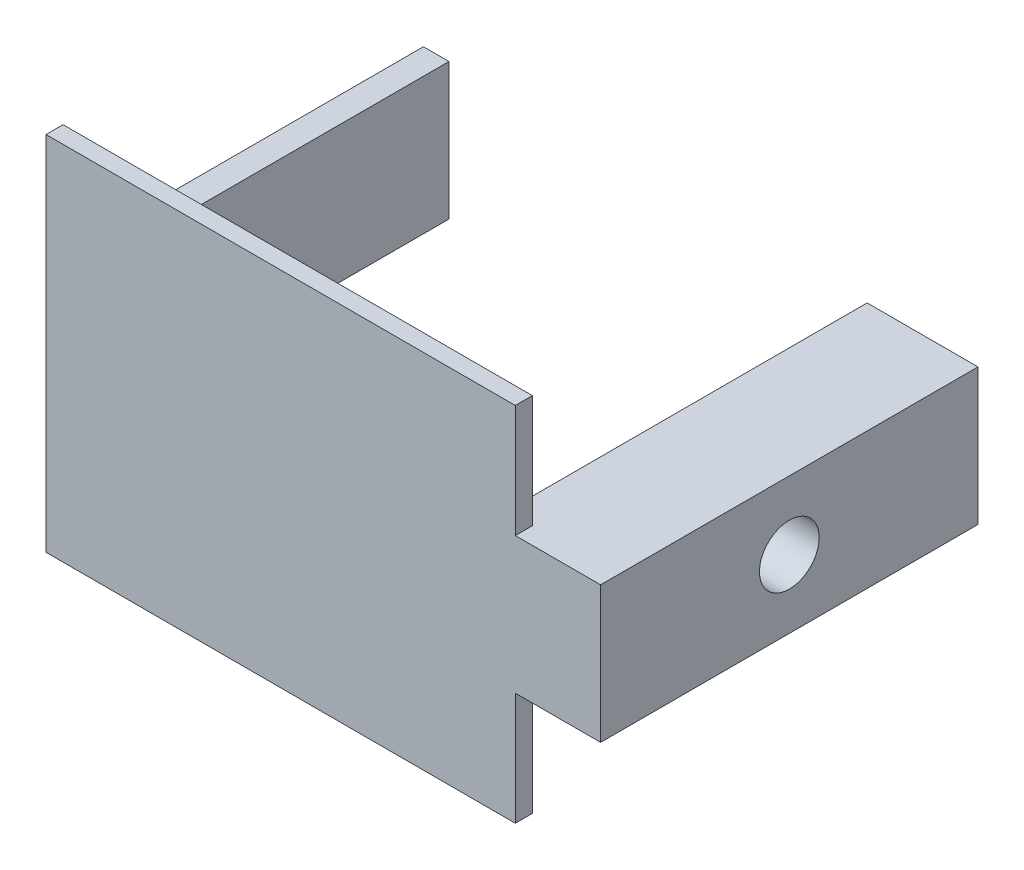
ISO-10303-21;
HEADER;
FILE_DESCRIPTION(('STEP AP214'),'2;1');
FILE_NAME('part.step','',(''),(''),'','','');
FILE_SCHEMA(('AUTOMOTIVE_DESIGN { 1 0 10303 214 1 1 1 1 }'));
ENDSEC;
DATA;
#1=APPLICATION_CONTEXT('core data for automotive mechanical design processes');
#2=APPLICATION_PROTOCOL_DEFINITION('international standard','automotive_design',2000,#1);
#3=PRODUCT_CONTEXT('',#1,'mechanical');
#4=PRODUCT('Part','Part','',(#3));
#5=PRODUCT_RELATED_PRODUCT_CATEGORY('part','',(#4));
#6=PRODUCT_DEFINITION_FORMATION('','',#4);
#7=PRODUCT_DEFINITION_CONTEXT('part definition',#1,'design');
#8=PRODUCT_DEFINITION('design','',#6,#7);
#9=PRODUCT_DEFINITION_SHAPE('','',#8);
#10=(LENGTH_UNIT() NAMED_UNIT(*) SI_UNIT(.MILLI.,.METRE.));
#11=(NAMED_UNIT(*) PLANE_ANGLE_UNIT() SI_UNIT($,.RADIAN.));
#12=(NAMED_UNIT(*) SI_UNIT($,.STERADIAN.) SOLID_ANGLE_UNIT());
#13=UNCERTAINTY_MEASURE_WITH_UNIT(LENGTH_MEASURE(1.E-05),#10,'distance_accuracy_value','');
#14=(GEOMETRIC_REPRESENTATION_CONTEXT(3) GLOBAL_UNCERTAINTY_ASSIGNED_CONTEXT((#13)) GLOBAL_UNIT_ASSIGNED_CONTEXT((#10,
#11,#12)) REPRESENTATION_CONTEXT('',''));
#15=CARTESIAN_POINT('',(0.,0.,0.));
#16=DIRECTION('',(0.,0.,1.));
#17=DIRECTION('',(1.,0.,0.));
#18=AXIS2_PLACEMENT_3D('',#15,#16,#17);
#19=CARTESIAN_POINT('',(27.512132034356,8.,58.7788205960997));
#20=DIRECTION('',(-1.,0.,0.));
#21=DIRECTION('',(0.,0.,1.));
#22=AXIS2_PLACEMENT_3D('',#19,#20,#21);
#23=PLANE('',#22);
#24=DIRECTION('',(0.,0.,-1.));
#25=VECTOR('',#24,1.);
#26=CARTESIAN_POINT('',(27.512132034356,-8.,0.));
#27=LINE('',#26,#25);
#28=CARTESIAN_POINT('',(27.512132034356,-8.,44.25));
#29=VERTEX_POINT('',#28);
#30=CARTESIAN_POINT('',(27.512132034356,-8.,42.25));
#31=VERTEX_POINT('',#30);
#32=EDGE_CURVE('E50',#29,#31,#27,.T.);
#33=ORIENTED_EDGE('',*,*,#32,.F.);
#34=DIRECTION('',(0.,1.,0.));
#35=VECTOR('',#34,1.);
#36=CARTESIAN_POINT('',(27.512132034356,21.212132034356,44.25));
#37=LINE('',#36,#35);
#38=CARTESIAN_POINT('',(27.512132034356,-21.212132034356,44.25));
#39=VERTEX_POINT('',#38);
#40=EDGE_CURVE('E214',#39,#29,#37,.T.);
#41=ORIENTED_EDGE('',*,*,#40,.F.);
#42=DIRECTION('',(0.,0.,-1.));
#43=VECTOR('',#42,1.);
#44=CARTESIAN_POINT('',(27.512132034356,-21.212132034356,44.25));
#45=LINE('',#44,#43);
#46=CARTESIAN_POINT('',(27.512132034356,-21.212132034356,42.25));
#47=VERTEX_POINT('',#46);
#48=EDGE_CURVE('E233',#39,#47,#45,.T.);
#49=ORIENTED_EDGE('',*,*,#48,.T.);
#50=DIRECTION('',(0.,1.,0.));
#51=VECTOR('',#50,1.);
#52=CARTESIAN_POINT('',(27.512132034356,21.212132034356,42.25));
#53=LINE('',#52,#51);
#54=EDGE_CURVE('E225',#47,#31,#53,.T.);
#55=ORIENTED_EDGE('',*,*,#54,.T.);
#56=EDGE_LOOP('',(#33,#41,#49,#55));
#57=FACE_BOUND('',#56,.T.);
#58=ADVANCED_FACE('F33',(#57),#23,.F.);
#59=CARTESIAN_POINT('',(0.,0.,42.25));
#60=DIRECTION('',(0.,0.,1.));
#61=DIRECTION('',(1.,0.,0.));
#62=AXIS2_PLACEMENT_3D('',#59,#60,#61);
#63=PLANE('',#62);
#64=DIRECTION('',(-1.,0.,0.));
#65=VECTOR('',#64,1.);
#66=CARTESIAN_POINT('',(-24.512132034356,8.,42.25));
#67=LINE('',#66,#65);
#68=CARTESIAN_POINT('',(-24.512132034356,8.,42.25));
#69=VERTEX_POINT('',#68);
#70=CARTESIAN_POINT('',(-27.512132034356,8.,42.25));
#71=VERTEX_POINT('',#70);
#72=EDGE_CURVE('E195',#69,#71,#67,.T.);
#73=ORIENTED_EDGE('',*,*,#72,.T.);
#74=DIRECTION('',(0.,-1.,0.));
#75=VECTOR('',#74,1.);
#76=CARTESIAN_POINT('',(-27.512132034356,21.212132034356,42.25));
#77=LINE('',#76,#75);
#78=CARTESIAN_POINT('',(-27.512132034356,21.212132034356,42.25));
#79=VERTEX_POINT('',#78);
#80=EDGE_CURVE('E219',#79,#71,#77,.T.);
#81=ORIENTED_EDGE('',*,*,#80,.F.);
#82=DIRECTION('',(-1.,0.,0.));
#83=VECTOR('',#82,1.);
#84=CARTESIAN_POINT('',(-27.512132034356,21.212132034356,42.25));
#85=LINE('',#84,#83);
#86=CARTESIAN_POINT('',(27.512132034356,21.212132034356,42.25));
#87=VERTEX_POINT('',#86);
#88=EDGE_CURVE('E211',#87,#79,#85,.T.);
#89=ORIENTED_EDGE('',*,*,#88,.F.);
#90=CARTESIAN_POINT('',(27.512132034356,8.,42.25));
#91=VERTEX_POINT('',#90);
#92=EDGE_CURVE('E224',#91,#87,#53,.T.);
#93=ORIENTED_EDGE('',*,*,#92,.F.);
#94=DIRECTION('',(-1.,0.,0.));
#95=VECTOR('',#94,1.);
#96=CARTESIAN_POINT('',(24.512132034356,8.,42.25));
#97=LINE('',#96,#95);
#98=CARTESIAN_POINT('',(24.512132034356,8.,42.25));
#99=VERTEX_POINT('',#98);
#100=EDGE_CURVE('E148',#91,#99,#97,.T.);
#101=ORIENTED_EDGE('',*,*,#100,.T.);
#102=DIRECTION('',(0.,-1.,0.));
#103=VECTOR('',#102,1.);
#104=CARTESIAN_POINT('',(24.512132034356,8.,42.25));
#105=LINE('',#104,#103);
#106=CARTESIAN_POINT('',(24.512132034356,-8.,42.25));
#107=VERTEX_POINT('',#106);
#108=EDGE_CURVE('E243',#99,#107,#105,.T.);
#109=ORIENTED_EDGE('',*,*,#108,.T.);
#110=DIRECTION('',(1.,0.,0.));
#111=VECTOR('',#110,1.);
#112=CARTESIAN_POINT('',(24.512132034356,-8.,42.25));
#113=LINE('',#112,#111);
#114=EDGE_CURVE('E42',#107,#31,#113,.T.);
#115=ORIENTED_EDGE('',*,*,#114,.T.);
#116=ORIENTED_EDGE('',*,*,#54,.F.);
#117=DIRECTION('',(1.,0.,0.));
#118=VECTOR('',#117,1.);
#119=CARTESIAN_POINT('',(-27.512132034356,-21.212132034356,42.25));
#120=LINE('',#119,#118);
#121=CARTESIAN_POINT('',(-27.512132034356,-21.212132034356,42.25));
#122=VERTEX_POINT('',#121);
#123=EDGE_CURVE('E222',#122,#47,#120,.T.);
#124=ORIENTED_EDGE('',*,*,#123,.F.);
#125=CARTESIAN_POINT('',(-27.512132034356,-8.,42.25));
#126=VERTEX_POINT('',#125);
#127=EDGE_CURVE('E198',#126,#122,#77,.T.);
#128=ORIENTED_EDGE('',*,*,#127,.F.);
#129=DIRECTION('',(1.,0.,0.));
#130=VECTOR('',#129,1.);
#131=CARTESIAN_POINT('',(-24.512132034356,-8.,42.25));
#132=LINE('',#131,#130);
#133=CARTESIAN_POINT('',(-24.512132034356,-8.,42.25));
#134=VERTEX_POINT('',#133);
#135=EDGE_CURVE('E58',#126,#134,#132,.T.);
#136=ORIENTED_EDGE('',*,*,#135,.T.);
#137=DIRECTION('',(0.,1.,0.));
#138=VECTOR('',#137,1.);
#139=CARTESIAN_POINT('',(-24.512132034356,8.,42.25));
#140=LINE('',#139,#138);
#141=EDGE_CURVE('E199',#134,#69,#140,.T.);
#142=ORIENTED_EDGE('',*,*,#141,.T.);
#143=EDGE_LOOP('',(#73,#81,#89,#93,#101,#109,#115,#116,#124,#128,#136,#142));
#144=FACE_BOUND('',#143,.T.);
#145=ADVANCED_FACE('F255',(#144),#63,.F.);
#146=CARTESIAN_POINT('',(24.512132034356,8.,58.7788205960997));
#147=DIRECTION('',(1.,0.,0.));
#148=DIRECTION('',(0.,0.,-1.));
#149=AXIS2_PLACEMENT_3D('',#146,#147,#148);
#150=PLANE('',#149);
#151=ORIENTED_EDGE('',*,*,#108,.F.);
#152=DIRECTION('',(0.,0.,-1.));
#153=VECTOR('',#152,1.);
#154=CARTESIAN_POINT('',(24.512132034356,8.,58.7788205960997));
#155=LINE('',#154,#153);
#156=CARTESIAN_POINT('',(24.512132034356,8.,0.));
#157=VERTEX_POINT('',#156);
#158=EDGE_CURVE('E37',#99,#157,#155,.T.);
#159=ORIENTED_EDGE('',*,*,#158,.T.);
#160=DIRECTION('',(0.,-1.,0.));
#161=VECTOR('',#160,1.);
#162=CARTESIAN_POINT('',(24.512132034356,8.,0.));
#163=LINE('',#162,#161);
#164=CARTESIAN_POINT('',(24.512132034356,-8.,0.));
#165=VERTEX_POINT('',#164);
#166=EDGE_CURVE('E146',#157,#165,#163,.T.);
#167=ORIENTED_EDGE('',*,*,#166,.T.);
#168=DIRECTION('',(0.,0.,-1.));
#169=VECTOR('',#168,1.);
#170=CARTESIAN_POINT('',(24.512132034356,-8.,58.7788205960997));
#171=LINE('',#170,#169);
#172=EDGE_CURVE('E240',#107,#165,#171,.T.);
#173=ORIENTED_EDGE('',*,*,#172,.F.);
#174=EDGE_LOOP('',(#151,#159,#167,#173));
#175=FACE_BOUND('',#174,.T.);
#176=ADVANCED_FACE('F35',(#175),#150,.F.);
#177=CARTESIAN_POINT('',(24.512132034356,-8.,58.7788205960997));
#178=DIRECTION('',(0.,1.,0.));
#179=DIRECTION('',(0.,0.,1.));
#180=AXIS2_PLACEMENT_3D('',#177,#178,#179);
#181=PLANE('',#180);
#182=ORIENTED_EDGE('',*,*,#114,.F.);
#183=ORIENTED_EDGE('',*,*,#172,.T.);
#184=DIRECTION('',(1.,0.,0.));
#185=VECTOR('',#184,1.);
#186=CARTESIAN_POINT('',(24.512132034356,-8.,0.));
#187=LINE('',#186,#185);
#188=CARTESIAN_POINT('',(37.512132034356,-8.,0.));
#189=VERTEX_POINT('',#188);
#190=EDGE_CURVE('E149',#165,#189,#187,.T.);
#191=ORIENTED_EDGE('',*,*,#190,.T.);
#192=DIRECTION('',(0.,0.,-1.));
#193=VECTOR('',#192,1.);
#194=CARTESIAN_POINT('',(37.512132034356,-8.,0.));
#195=LINE('',#194,#193);
#196=CARTESIAN_POINT('',(37.512132034356,-8.,44.25));
#197=VERTEX_POINT('',#196);
#198=EDGE_CURVE('E165',#197,#189,#195,.T.);
#199=ORIENTED_EDGE('',*,*,#198,.F.);
#200=DIRECTION('',(-1.,0.,0.));
#201=VECTOR('',#200,1.);
#202=CARTESIAN_POINT('',(37.512132034356,-8.,44.25));
#203=LINE('',#202,#201);
#204=EDGE_CURVE('E174',#197,#29,#203,.T.);
#205=ORIENTED_EDGE('',*,*,#204,.T.);
#206=ORIENTED_EDGE('',*,*,#32,.T.);
#207=EDGE_LOOP('',(#182,#183,#191,#199,#205,#206));
#208=FACE_BOUND('',#207,.T.);
#209=ADVANCED_FACE('F249',(#208),#181,.F.);
#210=DIRECTION('',(0.,0.,1.));
#211=VECTOR('',#210,1.);
#212=CARTESIAN_POINT('',(27.512132034356,8.,0.));
#213=LINE('',#212,#211);
#214=CARTESIAN_POINT('',(27.512132034356,8.,44.25));
#215=VERTEX_POINT('',#214);
#216=EDGE_CURVE('E11',#91,#215,#213,.T.);
#217=ORIENTED_EDGE('',*,*,#216,.F.);
#218=ORIENTED_EDGE('',*,*,#92,.T.);
#219=DIRECTION('',(0.,0.,-1.));
#220=VECTOR('',#219,1.);
#221=CARTESIAN_POINT('',(27.512132034356,21.212132034356,44.25));
#222=LINE('',#221,#220);
#223=CARTESIAN_POINT('',(27.512132034356,21.212132034356,44.25));
#224=VERTEX_POINT('',#223);
#225=EDGE_CURVE('E230',#224,#87,#222,.T.);
#226=ORIENTED_EDGE('',*,*,#225,.F.);
#227=EDGE_CURVE('E213',#215,#224,#37,.T.);
#228=ORIENTED_EDGE('',*,*,#227,.F.);
#229=EDGE_LOOP('',(#217,#218,#226,#228));
#230=FACE_BOUND('',#229,.T.);
#231=ADVANCED_FACE('F259',(#230),#23,.F.);
#232=CARTESIAN_POINT('',(24.512132034356,8.,58.7788205960997));
#233=DIRECTION('',(0.,-1.,0.));
#234=DIRECTION('',(0.,0.,-1.));
#235=AXIS2_PLACEMENT_3D('',#232,#233,#234);
#236=PLANE('',#235);
#237=ORIENTED_EDGE('',*,*,#100,.F.);
#238=ORIENTED_EDGE('',*,*,#216,.T.);
#239=DIRECTION('',(-1.,0.,0.));
#240=VECTOR('',#239,1.);
#241=CARTESIAN_POINT('',(37.512132034356,8.,44.25));
#242=LINE('',#241,#240);
#243=CARTESIAN_POINT('',(37.512132034356,8.,44.25));
#244=VERTEX_POINT('',#243);
#245=EDGE_CURVE('E156',#244,#215,#242,.T.);
#246=ORIENTED_EDGE('',*,*,#245,.F.);
#247=DIRECTION('',(0.,0.,1.));
#248=VECTOR('',#247,1.);
#249=CARTESIAN_POINT('',(37.512132034356,8.,0.));
#250=LINE('',#249,#248);
#251=CARTESIAN_POINT('',(37.512132034356,8.,0.));
#252=VERTEX_POINT('',#251);
#253=EDGE_CURVE('E152',#252,#244,#250,.T.);
#254=ORIENTED_EDGE('',*,*,#253,.F.);
#255=DIRECTION('',(-1.,0.,0.));
#256=VECTOR('',#255,1.);
#257=CARTESIAN_POINT('',(24.512132034356,8.,0.));
#258=LINE('',#257,#256);
#259=EDGE_CURVE('E139',#252,#157,#258,.T.);
#260=ORIENTED_EDGE('',*,*,#259,.T.);
#261=ORIENTED_EDGE('',*,*,#158,.F.);
#262=EDGE_LOOP('',(#237,#238,#246,#254,#260,#261));
#263=FACE_BOUND('',#262,.T.);
#264=ADVANCED_FACE('F154',(#263),#236,.F.);
#265=CARTESIAN_POINT('',(0.,0.,0.));
#266=DIRECTION('',(0.,0.,1.));
#267=DIRECTION('',(1.,0.,0.));
#268=AXIS2_PLACEMENT_3D('',#265,#266,#267);
#269=PLANE('',#268);
#270=ORIENTED_EDGE('',*,*,#166,.F.);
#271=ORIENTED_EDGE('',*,*,#259,.F.);
#272=DIRECTION('',(0.,1.,0.));
#273=VECTOR('',#272,1.);
#274=CARTESIAN_POINT('',(37.512132034356,-8.,0.));
#275=LINE('',#274,#273);
#276=EDGE_CURVE('E144',#189,#252,#275,.T.);
#277=ORIENTED_EDGE('',*,*,#276,.F.);
#278=ORIENTED_EDGE('',*,*,#190,.F.);
#279=EDGE_LOOP('',(#270,#271,#277,#278));
#280=FACE_BOUND('',#279,.T.);
#281=ADVANCED_FACE('F141',(#280),#269,.F.);
#282=CARTESIAN_POINT('',(-27.512132034356,21.212132034356,44.25));
#283=DIRECTION('',(1.,0.,0.));
#284=DIRECTION('',(0.,1.,0.));
#285=AXIS2_PLACEMENT_3D('',#282,#283,#284);
#286=PLANE('',#285);
#287=ORIENTED_EDGE('',*,*,#80,.T.);
#288=DIRECTION('',(0.,0.,-1.));
#289=VECTOR('',#288,1.);
#290=CARTESIAN_POINT('',(-27.512132034356,8.,58.7788205960997));
#291=LINE('',#290,#289);
#292=CARTESIAN_POINT('',(-27.512132034356,8.,0.));
#293=VERTEX_POINT('',#292);
#294=EDGE_CURVE('E187',#71,#293,#291,.T.);
#295=ORIENTED_EDGE('',*,*,#294,.T.);
#296=DIRECTION('',(0.,-1.,0.));
#297=VECTOR('',#296,1.);
#298=CARTESIAN_POINT('',(-27.512132034356,8.,0.));
#299=LINE('',#298,#297);
#300=CARTESIAN_POINT('',(-27.512132034356,-8.,0.));
#301=VERTEX_POINT('',#300);
#302=EDGE_CURVE('E184',#293,#301,#299,.T.);
#303=ORIENTED_EDGE('',*,*,#302,.T.);
#304=DIRECTION('',(0.,0.,-1.));
#305=VECTOR('',#304,1.);
#306=CARTESIAN_POINT('',(-27.512132034356,-8.,58.7788205960997));
#307=LINE('',#306,#305);
#308=EDGE_CURVE('E183',#126,#301,#307,.T.);
#309=ORIENTED_EDGE('',*,*,#308,.F.);
#310=ORIENTED_EDGE('',*,*,#127,.T.);
#311=DIRECTION('',(0.,0.,-1.));
#312=VECTOR('',#311,1.);
#313=CARTESIAN_POINT('',(-27.512132034356,-21.212132034356,44.25));
#314=LINE('',#313,#312);
#315=CARTESIAN_POINT('',(-27.512132034356,-21.212132034356,44.25));
#316=VERTEX_POINT('',#315);
#317=EDGE_CURVE('E236',#316,#122,#314,.T.);
#318=ORIENTED_EDGE('',*,*,#317,.F.);
#319=DIRECTION('',(0.,-1.,0.));
#320=VECTOR('',#319,1.);
#321=CARTESIAN_POINT('',(-27.512132034356,21.212132034356,44.25));
#322=LINE('',#321,#320);
#323=CARTESIAN_POINT('',(-27.512132034356,21.212132034356,44.25));
#324=VERTEX_POINT('',#323);
#325=EDGE_CURVE('E207',#324,#316,#322,.T.);
#326=ORIENTED_EDGE('',*,*,#325,.F.);
#327=DIRECTION('',(0.,0.,-1.));
#328=VECTOR('',#327,1.);
#329=CARTESIAN_POINT('',(-27.512132034356,21.212132034356,44.25));
#330=LINE('',#329,#328);
#331=EDGE_CURVE('E218',#324,#79,#330,.T.);
#332=ORIENTED_EDGE('',*,*,#331,.T.);
#333=EDGE_LOOP('',(#287,#295,#303,#309,#310,#318,#326,#332));
#334=FACE_BOUND('',#333,.T.);
#335=ADVANCED_FACE('F276',(#334),#286,.F.);
#336=CARTESIAN_POINT('',(-27.512132034356,-21.212132034356,44.25));
#337=DIRECTION('',(0.,1.,0.));
#338=DIRECTION('',(0.,0.,1.));
#339=AXIS2_PLACEMENT_3D('',#336,#337,#338);
#340=PLANE('',#339);
#341=ORIENTED_EDGE('',*,*,#123,.T.);
#342=ORIENTED_EDGE('',*,*,#48,.F.);
#343=DIRECTION('',(1.,0.,0.));
#344=VECTOR('',#343,1.);
#345=CARTESIAN_POINT('',(-27.512132034356,-21.212132034356,44.25));
#346=LINE('',#345,#344);
#347=EDGE_CURVE('E210',#316,#39,#346,.T.);
#348=ORIENTED_EDGE('',*,*,#347,.F.);
#349=ORIENTED_EDGE('',*,*,#317,.T.);
#350=EDGE_LOOP('',(#341,#342,#348,#349));
#351=FACE_BOUND('',#350,.T.);
#352=ADVANCED_FACE('F274',(#351),#340,.F.);
#353=CARTESIAN_POINT('',(-27.512132034356,21.212132034356,44.25));
#354=DIRECTION('',(0.,-1.,0.));
#355=DIRECTION('',(0.,0.,-1.));
#356=AXIS2_PLACEMENT_3D('',#353,#354,#355);
#357=PLANE('',#356);
#358=ORIENTED_EDGE('',*,*,#88,.T.);
#359=ORIENTED_EDGE('',*,*,#331,.F.);
#360=DIRECTION('',(-1.,0.,0.));
#361=VECTOR('',#360,1.);
#362=CARTESIAN_POINT('',(-27.512132034356,21.212132034356,44.25));
#363=LINE('',#362,#361);
#364=EDGE_CURVE('E216',#224,#324,#363,.T.);
#365=ORIENTED_EDGE('',*,*,#364,.F.);
#366=ORIENTED_EDGE('',*,*,#225,.T.);
#367=EDGE_LOOP('',(#358,#359,#365,#366));
#368=FACE_BOUND('',#367,.T.);
#369=ADVANCED_FACE('F262',(#368),#357,.F.);
#370=CARTESIAN_POINT('',(0.,0.,44.25));
#371=DIRECTION('',(0.,0.,1.));
#372=DIRECTION('',(1.,0.,0.));
#373=AXIS2_PLACEMENT_3D('',#370,#371,#372);
#374=PLANE('',#373);
#375=ORIENTED_EDGE('',*,*,#325,.T.);
#376=ORIENTED_EDGE('',*,*,#347,.T.);
#377=ORIENTED_EDGE('',*,*,#40,.T.);
#378=ORIENTED_EDGE('',*,*,#204,.F.);
#379=DIRECTION('',(0.,-1.,0.));
#380=VECTOR('',#379,1.);
#381=CARTESIAN_POINT('',(37.512132034356,-8.,44.25));
#382=LINE('',#381,#380);
#383=EDGE_CURVE('E159',#244,#197,#382,.T.);
#384=ORIENTED_EDGE('',*,*,#383,.F.);
#385=ORIENTED_EDGE('',*,*,#245,.T.);
#386=ORIENTED_EDGE('',*,*,#227,.T.);
#387=ORIENTED_EDGE('',*,*,#364,.T.);
#388=EDGE_LOOP('',(#375,#376,#377,#378,#384,#385,#386,#387));
#389=FACE_BOUND('',#388,.T.);
#390=ADVANCED_FACE('F266',(#389),#374,.T.);
#391=CARTESIAN_POINT('',(-24.512132034356,8.,58.7788205960997));
#392=DIRECTION('',(-1.,0.,0.));
#393=DIRECTION('',(0.,0.,1.));
#394=AXIS2_PLACEMENT_3D('',#391,#392,#393);
#395=PLANE('',#394);
#396=ORIENTED_EDGE('',*,*,#141,.F.);
#397=DIRECTION('',(0.,0.,-1.));
#398=VECTOR('',#397,1.);
#399=CARTESIAN_POINT('',(-24.512132034356,-8.,58.7788205960997));
#400=LINE('',#399,#398);
#401=CARTESIAN_POINT('',(-24.512132034356,-8.,0.));
#402=VERTEX_POINT('',#401);
#403=EDGE_CURVE('E179',#134,#402,#400,.T.);
#404=ORIENTED_EDGE('',*,*,#403,.T.);
#405=DIRECTION('',(0.,1.,0.));
#406=VECTOR('',#405,1.);
#407=CARTESIAN_POINT('',(-24.512132034356,8.,0.));
#408=LINE('',#407,#406);
#409=CARTESIAN_POINT('',(-24.512132034356,8.,0.));
#410=VERTEX_POINT('',#409);
#411=EDGE_CURVE('E192',#402,#410,#408,.T.);
#412=ORIENTED_EDGE('',*,*,#411,.T.);
#413=DIRECTION('',(0.,0.,-1.));
#414=VECTOR('',#413,1.);
#415=CARTESIAN_POINT('',(-24.512132034356,8.,58.7788205960997));
#416=LINE('',#415,#414);
#417=EDGE_CURVE('E191',#69,#410,#416,.T.);
#418=ORIENTED_EDGE('',*,*,#417,.F.);
#419=EDGE_LOOP('',(#396,#404,#412,#418));
#420=FACE_BOUND('',#419,.T.);
#421=ADVANCED_FACE('F287',(#420),#395,.F.);
#422=CARTESIAN_POINT('',(-24.512132034356,8.,58.7788205960997));
#423=DIRECTION('',(0.,-1.,0.));
#424=DIRECTION('',(1.,0.,0.));
#425=AXIS2_PLACEMENT_3D('',#422,#423,#424);
#426=PLANE('',#425);
#427=ORIENTED_EDGE('',*,*,#72,.F.);
#428=ORIENTED_EDGE('',*,*,#417,.T.);
#429=DIRECTION('',(-1.,0.,0.));
#430=VECTOR('',#429,1.);
#431=CARTESIAN_POINT('',(-24.512132034356,8.,0.));
#432=LINE('',#431,#430);
#433=EDGE_CURVE('E188',#410,#293,#432,.T.);
#434=ORIENTED_EDGE('',*,*,#433,.T.);
#435=ORIENTED_EDGE('',*,*,#294,.F.);
#436=EDGE_LOOP('',(#427,#428,#434,#435));
#437=FACE_BOUND('',#436,.T.);
#438=ADVANCED_FACE('F289',(#437),#426,.F.);
#439=CARTESIAN_POINT('',(-24.512132034356,-8.,58.7788205960997));
#440=DIRECTION('',(0.,1.,0.));
#441=DIRECTION('',(-1.,0.,0.));
#442=AXIS2_PLACEMENT_3D('',#439,#440,#441);
#443=PLANE('',#442);
#444=ORIENTED_EDGE('',*,*,#135,.F.);
#445=ORIENTED_EDGE('',*,*,#308,.T.);
#446=DIRECTION('',(1.,0.,0.));
#447=VECTOR('',#446,1.);
#448=CARTESIAN_POINT('',(-24.512132034356,-8.,0.));
#449=LINE('',#448,#447);
#450=EDGE_CURVE('E180',#301,#402,#449,.T.);
#451=ORIENTED_EDGE('',*,*,#450,.T.);
#452=ORIENTED_EDGE('',*,*,#403,.F.);
#453=EDGE_LOOP('',(#444,#445,#451,#452));
#454=FACE_BOUND('',#453,.T.);
#455=ADVANCED_FACE('F279',(#454),#443,.F.);
#456=CARTESIAN_POINT('',(0.,0.,0.));
#457=DIRECTION('',(0.,0.,-1.));
#458=DIRECTION('',(-1.,0.,0.));
#459=AXIS2_PLACEMENT_3D('',#456,#457,#458);
#460=PLANE('',#459);
#461=ORIENTED_EDGE('',*,*,#411,.F.);
#462=ORIENTED_EDGE('',*,*,#450,.F.);
#463=ORIENTED_EDGE('',*,*,#302,.F.);
#464=ORIENTED_EDGE('',*,*,#433,.F.);
#465=EDGE_LOOP('',(#461,#462,#463,#464));
#466=FACE_BOUND('',#465,.T.);
#467=ADVANCED_FACE('F284',(#466),#460,.T.);
#468=CARTESIAN_POINT('',(37.512132034356,0.,0.));
#469=DIRECTION('',(1.,0.,0.));
#470=DIRECTION('',(0.,0.,-1.));
#471=AXIS2_PLACEMENT_3D('',#468,#469,#470);
#472=PLANE('',#471);
#473=ORIENTED_EDGE('',*,*,#276,.T.);
#474=ORIENTED_EDGE('',*,*,#253,.T.);
#475=ORIENTED_EDGE('',*,*,#383,.T.);
#476=ORIENTED_EDGE('',*,*,#198,.T.);
#477=EDGE_LOOP('',(#473,#474,#475,#476));
#478=FACE_BOUND('',#477,.T.);
#479=CARTESIAN_POINT('',(37.512132034356,0.,22.125));
#480=DIRECTION('',(1.,0.,0.));
#481=DIRECTION('',(0.,0.,-1.));
#482=AXIS2_PLACEMENT_3D('',#479,#480,#481);
#483=CIRCLE('',#482,3.5);
#484=CARTESIAN_POINT('',(37.512132034356,0.,18.625));
#485=VERTEX_POINT('',#484);
#486=EDGE_CURVE('E167',#485,#485,#483,.T.);
#487=ORIENTED_EDGE('',*,*,#486,.F.);
#488=EDGE_LOOP('',(#487));
#489=FACE_BOUND('',#488,.T.);
#490=ADVANCED_FACE('F162',(#478,#489),#472,.T.);
#491=CARTESIAN_POINT('',(37.512132034356,0.,22.125));
#492=DIRECTION('',(-1.,0.,0.));
#493=DIRECTION('',(0.,0.,1.));
#494=AXIS2_PLACEMENT_3D('',#491,#492,#493);
#495=CYLINDRICAL_SURFACE('',#494,3.5);
#496=ORIENTED_EDGE('',*,*,#486,.T.);
#497=EDGE_LOOP('',(#496));
#498=FACE_BOUND('',#497,.T.);
#499=CARTESIAN_POINT('',(27.512132034356,0.,22.125));
#500=DIRECTION('',(1.,0.,0.));
#501=DIRECTION('',(0.,0.,-1.));
#502=AXIS2_PLACEMENT_3D('',#499,#500,#501);
#503=CIRCLE('',#502,3.5);
#504=CARTESIAN_POINT('',(27.512132034356,0.,18.625));
#505=VERTEX_POINT('',#504);
#506=EDGE_CURVE('E170',#505,#505,#503,.T.);
#507=ORIENTED_EDGE('',*,*,#506,.F.);
#508=EDGE_LOOP('',(#507));
#509=FACE_BOUND('',#508,.T.);
#510=ADVANCED_FACE('F308',(#498,#509),#495,.F.);
#511=ORIENTED_EDGE('',*,*,#506,.T.);
#512=EDGE_LOOP('',(#511));
#513=FACE_BOUND('',#512,.T.);
#514=ADVANCED_FACE('F300',(#513),#23,.F.);
#515=CLOSED_SHELL('',(#58,#145,#176,#209,#231,#264,#281,#335,#352,#369,#390,#421,#438,#455,#467,
#490,#510,#514));
#516=MANIFOLD_SOLID_BREP('B2',#515);
#517=ADVANCED_BREP_SHAPE_REPRESENTATION('',(#18,#516),#14);
#518=SHAPE_DEFINITION_REPRESENTATION(#9,#517);
ENDSEC;
END-ISO-10303-21;
